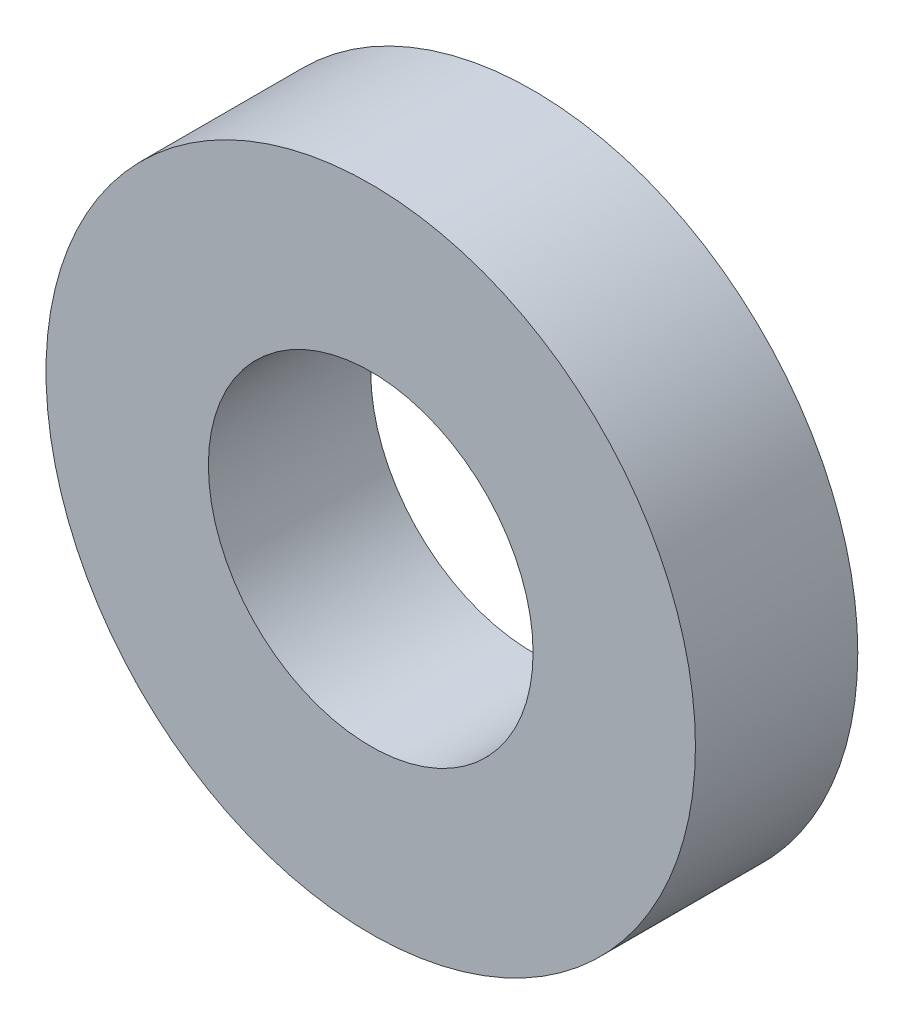
ISO-10303-21;
HEADER;
FILE_DESCRIPTION(('STEP AP214'),'2;1');
FILE_NAME('part.step','',(''),(''),'','','');
FILE_SCHEMA(('AUTOMOTIVE_DESIGN { 1 0 10303 214 1 1 1 1 }'));
ENDSEC;
DATA;
#1=APPLICATION_CONTEXT('core data for automotive mechanical design processes');
#2=APPLICATION_PROTOCOL_DEFINITION('international standard','automotive_design',2000,#1);
#3=PRODUCT_CONTEXT('',#1,'mechanical');
#4=PRODUCT('Part','Part','',(#3));
#5=PRODUCT_RELATED_PRODUCT_CATEGORY('part','',(#4));
#6=PRODUCT_DEFINITION_FORMATION('','',#4);
#7=PRODUCT_DEFINITION_CONTEXT('part definition',#1,'design');
#8=PRODUCT_DEFINITION('design','',#6,#7);
#9=PRODUCT_DEFINITION_SHAPE('','',#8);
#10=(LENGTH_UNIT() NAMED_UNIT(*) SI_UNIT(.MILLI.,.METRE.));
#11=(NAMED_UNIT(*) PLANE_ANGLE_UNIT() SI_UNIT($,.RADIAN.));
#12=(NAMED_UNIT(*) SI_UNIT($,.STERADIAN.) SOLID_ANGLE_UNIT());
#13=UNCERTAINTY_MEASURE_WITH_UNIT(LENGTH_MEASURE(1.E-05),#10,'distance_accuracy_value','');
#14=(GEOMETRIC_REPRESENTATION_CONTEXT(3) GLOBAL_UNCERTAINTY_ASSIGNED_CONTEXT((#13)) GLOBAL_UNIT_ASSIGNED_CONTEXT((#10,
#11,#12)) REPRESENTATION_CONTEXT('',''));
#15=CARTESIAN_POINT('',(0.,0.,0.));
#16=DIRECTION('',(0.,0.,1.));
#17=DIRECTION('',(1.,0.,0.));
#18=AXIS2_PLACEMENT_3D('',#15,#16,#17);
#19=CARTESIAN_POINT('',(0.,0.,3.));
#20=DIRECTION('',(0.,0.,1.));
#21=DIRECTION('',(1.,0.,0.));
#22=AXIS2_PLACEMENT_3D('',#19,#20,#21);
#23=PLANE('',#22);
#24=CARTESIAN_POINT('',(0.,0.,3.));
#25=DIRECTION('',(0.,0.,1.));
#26=DIRECTION('',(1.,0.,0.));
#27=AXIS2_PLACEMENT_3D('',#24,#25,#26);
#28=CIRCLE('',#27,6.);
#29=CARTESIAN_POINT('',(6.,0.,3.));
#30=VERTEX_POINT('',#29);
#31=EDGE_CURVE('E10',#30,#30,#28,.T.);
#32=ORIENTED_EDGE('',*,*,#31,.T.);
#33=EDGE_LOOP('',(#32));
#34=FACE_BOUND('',#33,.T.);
#35=CARTESIAN_POINT('',(0.,0.,3.));
#36=DIRECTION('',(0.,0.,1.));
#37=DIRECTION('',(1.,0.,0.));
#38=AXIS2_PLACEMENT_3D('',#35,#36,#37);
#39=CIRCLE('',#38,3.);
#40=CARTESIAN_POINT('',(3.,0.,3.));
#41=VERTEX_POINT('',#40);
#42=EDGE_CURVE('E50',#41,#41,#39,.T.);
#43=ORIENTED_EDGE('',*,*,#42,.F.);
#44=EDGE_LOOP('',(#43));
#45=FACE_BOUND('',#44,.T.);
#46=ADVANCED_FACE('F37',(#34,#45),#23,.T.);
#47=CARTESIAN_POINT('',(0.,0.,0.));
#48=DIRECTION('',(0.,0.,1.));
#49=DIRECTION('',(1.,0.,0.));
#50=AXIS2_PLACEMENT_3D('',#47,#48,#49);
#51=PLANE('',#50);
#52=CARTESIAN_POINT('',(0.,0.,0.));
#53=DIRECTION('',(0.,0.,1.));
#54=DIRECTION('',(1.,0.,0.));
#55=AXIS2_PLACEMENT_3D('',#52,#53,#54);
#56=CIRCLE('',#55,6.);
#57=CARTESIAN_POINT('',(6.,0.,0.));
#58=VERTEX_POINT('',#57);
#59=EDGE_CURVE('E41',#58,#58,#56,.T.);
#60=ORIENTED_EDGE('',*,*,#59,.F.);
#61=EDGE_LOOP('',(#60));
#62=FACE_BOUND('',#61,.T.);
#63=CARTESIAN_POINT('',(0.,0.,0.));
#64=DIRECTION('',(0.,0.,1.));
#65=DIRECTION('',(1.,0.,0.));
#66=AXIS2_PLACEMENT_3D('',#63,#64,#65);
#67=CIRCLE('',#66,3.);
#68=CARTESIAN_POINT('',(3.,0.,0.));
#69=VERTEX_POINT('',#68);
#70=EDGE_CURVE('E52',#69,#69,#67,.T.);
#71=ORIENTED_EDGE('',*,*,#70,.T.);
#72=EDGE_LOOP('',(#71));
#73=FACE_BOUND('',#72,.T.);
#74=ADVANCED_FACE('F64',(#62,#73),#51,.F.);
#75=CARTESIAN_POINT('',(0.,0.,3.));
#76=DIRECTION('',(0.,0.,-1.));
#77=DIRECTION('',(-1.,0.,0.));
#78=AXIS2_PLACEMENT_3D('',#75,#76,#77);
#79=CYLINDRICAL_SURFACE('',#78,6.);
#80=ORIENTED_EDGE('',*,*,#31,.F.);
#81=EDGE_LOOP('',(#80));
#82=FACE_BOUND('',#81,.T.);
#83=ORIENTED_EDGE('',*,*,#59,.T.);
#84=EDGE_LOOP('',(#83));
#85=FACE_BOUND('',#84,.T.);
#86=ADVANCED_FACE('F39',(#82,#85),#79,.T.);
#87=CARTESIAN_POINT('',(0.,0.,3.));
#88=DIRECTION('',(0.,0.,-1.));
#89=DIRECTION('',(-1.,0.,0.));
#90=AXIS2_PLACEMENT_3D('',#87,#88,#89);
#91=CYLINDRICAL_SURFACE('',#90,3.);
#92=ORIENTED_EDGE('',*,*,#42,.T.);
#93=EDGE_LOOP('',(#92));
#94=FACE_BOUND('',#93,.T.);
#95=ORIENTED_EDGE('',*,*,#70,.F.);
#96=EDGE_LOOP('',(#95));
#97=FACE_BOUND('',#96,.T.);
#98=ADVANCED_FACE('F60',(#94,#97),#91,.F.);
#99=CLOSED_SHELL('',(#46,#74,#86,#98));
#100=MANIFOLD_SOLID_BREP('B2',#99);
#101=ADVANCED_BREP_SHAPE_REPRESENTATION('',(#18,#100),#14);
#102=SHAPE_DEFINITION_REPRESENTATION(#9,#101);
ENDSEC;
END-ISO-10303-21;
